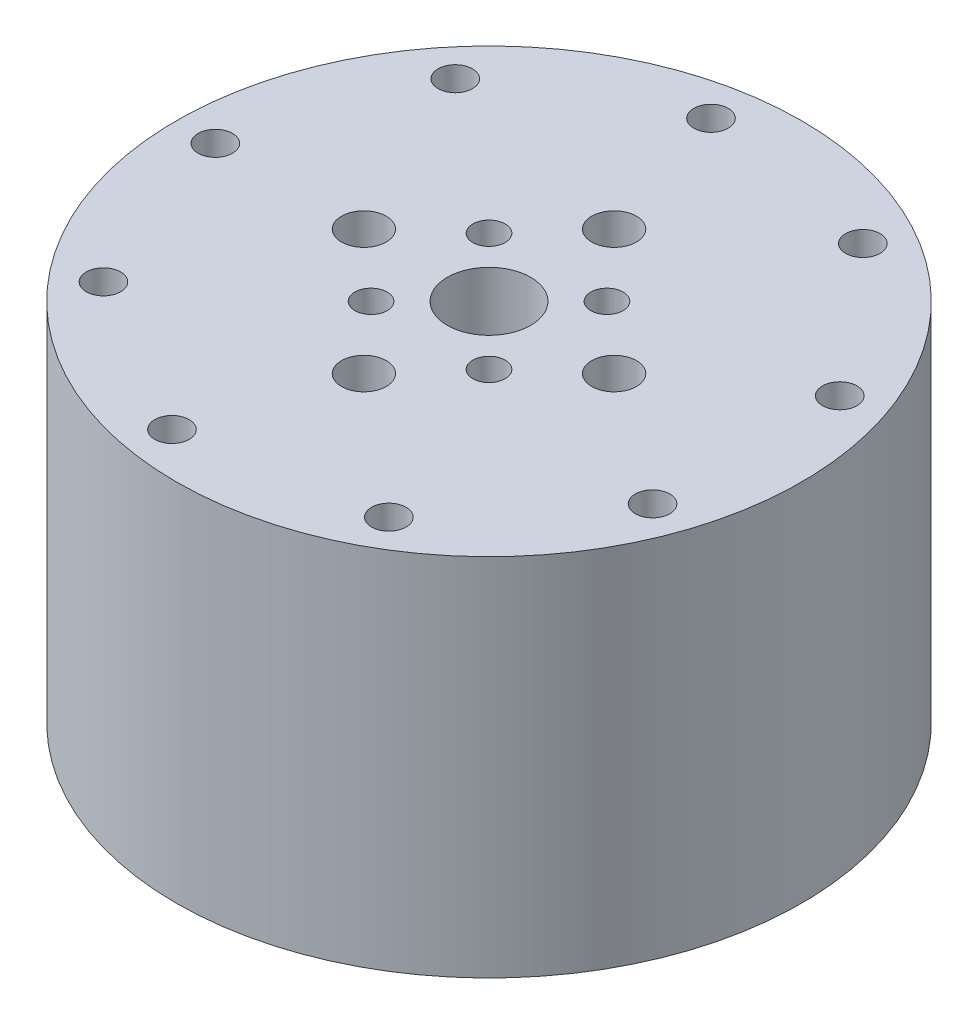
ISO-10303-21;
HEADER;
FILE_DESCRIPTION(('STEP AP214'),'2;1');
FILE_NAME('part.step','',(''),(''),'','','');
FILE_SCHEMA(('AUTOMOTIVE_DESIGN { 1 0 10303 214 1 1 1 1 }'));
ENDSEC;
DATA;
#1=APPLICATION_CONTEXT('core data for automotive mechanical design processes');
#2=APPLICATION_PROTOCOL_DEFINITION('international standard','automotive_design',2000,#1);
#3=PRODUCT_CONTEXT('',#1,'mechanical');
#4=PRODUCT('Part','Part','',(#3));
#5=PRODUCT_RELATED_PRODUCT_CATEGORY('part','',(#4));
#6=PRODUCT_DEFINITION_FORMATION('','',#4);
#7=PRODUCT_DEFINITION_CONTEXT('part definition',#1,'design');
#8=PRODUCT_DEFINITION('design','',#6,#7);
#9=PRODUCT_DEFINITION_SHAPE('','',#8);
#10=(LENGTH_UNIT() NAMED_UNIT(*) SI_UNIT(.MILLI.,.METRE.));
#11=(NAMED_UNIT(*) PLANE_ANGLE_UNIT() SI_UNIT($,.RADIAN.));
#12=(NAMED_UNIT(*) SI_UNIT($,.STERADIAN.) SOLID_ANGLE_UNIT());
#13=UNCERTAINTY_MEASURE_WITH_UNIT(LENGTH_MEASURE(1.E-05),#10,'distance_accuracy_value','');
#14=(GEOMETRIC_REPRESENTATION_CONTEXT(3) GLOBAL_UNCERTAINTY_ASSIGNED_CONTEXT((#13)) GLOBAL_UNIT_ASSIGNED_CONTEXT((#10,
#11,#12)) REPRESENTATION_CONTEXT('',''));
#15=CARTESIAN_POINT('',(0.,0.,0.));
#16=DIRECTION('',(0.,0.,1.));
#17=DIRECTION('',(1.,0.,0.));
#18=AXIS2_PLACEMENT_3D('',#15,#16,#17);
#19=CARTESIAN_POINT('',(0.,35.,0.));
#20=DIRECTION('',(0.,-1.,0.));
#21=DIRECTION('',(0.,0.,-1.));
#22=AXIS2_PLACEMENT_3D('',#19,#20,#21);
#23=CYLINDRICAL_SURFACE('',#22,30.);
#24=CARTESIAN_POINT('',(0.,35.,0.));
#25=DIRECTION('',(0.,1.,0.));
#26=DIRECTION('',(0.,0.,1.));
#27=AXIS2_PLACEMENT_3D('',#24,#25,#26);
#28=CIRCLE('',#27,30.);
#29=CARTESIAN_POINT('',(0.,35.,30.));
#30=VERTEX_POINT('',#29);
#31=EDGE_CURVE('E10',#30,#30,#28,.T.);
#32=ORIENTED_EDGE('',*,*,#31,.F.);
#33=EDGE_LOOP('',(#32));
#34=FACE_BOUND('',#33,.T.);
#35=CARTESIAN_POINT('',(0.,0.,0.));
#36=DIRECTION('',(0.,1.,0.));
#37=DIRECTION('',(0.,0.,1.));
#38=AXIS2_PLACEMENT_3D('',#35,#36,#37);
#39=CIRCLE('',#38,30.);
#40=CARTESIAN_POINT('',(0.,0.,30.));
#41=VERTEX_POINT('',#40);
#42=EDGE_CURVE('E39',#41,#41,#39,.T.);
#43=ORIENTED_EDGE('',*,*,#42,.T.);
#44=EDGE_LOOP('',(#43));
#45=FACE_BOUND('',#44,.T.);
#46=ADVANCED_FACE('F36',(#34,#45),#23,.T.);
#47=CARTESIAN_POINT('',(0.,35.,0.));
#48=DIRECTION('',(0.,1.,0.));
#49=DIRECTION('',(0.,0.,1.));
#50=AXIS2_PLACEMENT_3D('',#47,#48,#49);
#51=PLANE('',#50);
#52=CARTESIAN_POINT('',(0.,35.,12.));
#53=DIRECTION('',(0.,-1.,0.));
#54=DIRECTION('',(0.,0.,-1.));
#55=AXIS2_PLACEMENT_3D('',#52,#53,#54);
#56=CIRCLE('',#55,2.15);
#57=CARTESIAN_POINT('',(0.,35.,9.85));
#58=VERTEX_POINT('',#57);
#59=EDGE_CURVE('E111',#58,#58,#56,.T.);
#60=ORIENTED_EDGE('',*,*,#59,.T.);
#61=EDGE_LOOP('',(#60));
#62=FACE_BOUND('',#61,.T.);
#63=CARTESIAN_POINT('',(5.65685424949233,35.,-5.65685424949243));
#64=DIRECTION('',(0.,-1.,0.));
#65=DIRECTION('',(0.,0.,-1.));
#66=AXIS2_PLACEMENT_3D('',#63,#64,#65);
#67=CIRCLE('',#66,1.55);
#68=CARTESIAN_POINT('',(5.65685424949233,35.,-7.20685424949243));
#69=VERTEX_POINT('',#68);
#70=EDGE_CURVE('E143',#69,#69,#67,.T.);
#71=ORIENTED_EDGE('',*,*,#70,.T.);
#72=EDGE_LOOP('',(#71));
#73=FACE_BOUND('',#72,.T.);
#74=CARTESIAN_POINT('',(5.65685424949241,35.,5.65685424949235));
#75=DIRECTION('',(0.,-1.,0.));
#76=DIRECTION('',(0.,0.,-1.));
#77=AXIS2_PLACEMENT_3D('',#74,#75,#76);
#78=CIRCLE('',#77,1.55);
#79=CARTESIAN_POINT('',(5.65685424949241,35.,4.10685424949235));
#80=VERTEX_POINT('',#79);
#81=EDGE_CURVE('E149',#80,#80,#78,.T.);
#82=ORIENTED_EDGE('',*,*,#81,.T.);
#83=EDGE_LOOP('',(#82));
#84=FACE_BOUND('',#83,.T.);
#85=CARTESIAN_POINT('',(-11.9999999999997,35.,-3.41060513164848E-13));
#86=DIRECTION('',(0.,-1.,0.));
#87=DIRECTION('',(0.,0.,-1.));
#88=AXIS2_PLACEMENT_3D('',#85,#86,#87);
#89=CIRCLE('',#88,2.15000000000055);
#90=CARTESIAN_POINT('',(-11.9999999999997,35.,-2.15000000000089));
#91=VERTEX_POINT('',#90);
#92=EDGE_CURVE('E132',#91,#91,#89,.T.);
#93=ORIENTED_EDGE('',*,*,#92,.T.);
#94=EDGE_LOOP('',(#93));
#95=FACE_BOUND('',#94,.T.);
#96=CARTESIAN_POINT('',(-5.65685424949237,35.,-5.65685424949239));
#97=DIRECTION('',(0.,-1.,0.));
#98=DIRECTION('',(0.,0.,-1.));
#99=AXIS2_PLACEMENT_3D('',#96,#97,#98);
#100=CIRCLE('',#99,1.55);
#101=CARTESIAN_POINT('',(-5.65685424949237,35.,-7.20685424949239));
#102=VERTEX_POINT('',#101);
#103=EDGE_CURVE('E124',#102,#102,#100,.T.);
#104=ORIENTED_EDGE('',*,*,#103,.T.);
#105=EDGE_LOOP('',(#104));
#106=FACE_BOUND('',#105,.T.);
#107=CARTESIAN_POINT('',(12.0000000000003,35.,3.39590937005871E-13));
#108=DIRECTION('',(0.,-1.,0.));
#109=DIRECTION('',(0.,0.,-1.));
#110=AXIS2_PLACEMENT_3D('',#107,#108,#109);
#111=CIRCLE('',#110,2.15000000000027);
#112=CARTESIAN_POINT('',(12.0000000000003,35.,-2.14999999999993));
#113=VERTEX_POINT('',#112);
#114=EDGE_CURVE('E117',#113,#113,#111,.T.);
#115=ORIENTED_EDGE('',*,*,#114,.T.);
#116=EDGE_LOOP('',(#115));
#117=FACE_BOUND('',#116,.T.);
#118=CARTESIAN_POINT('',(-5.65685424949237,35.,5.65685424949239));
#119=DIRECTION('',(0.,-1.,0.));
#120=DIRECTION('',(0.,0.,-1.));
#121=AXIS2_PLACEMENT_3D('',#118,#119,#120);
#122=CIRCLE('',#121,1.55);
#123=CARTESIAN_POINT('',(-5.65685424949237,35.,4.10685424949239));
#124=VERTEX_POINT('',#123);
#125=EDGE_CURVE('E118',#124,#124,#122,.T.);
#126=ORIENTED_EDGE('',*,*,#125,.T.);
#127=EDGE_LOOP('',(#126));
#128=FACE_BOUND('',#127,.T.);
#129=CARTESIAN_POINT('',(6.79181874011743E-13,35.,-12.));
#130=DIRECTION('',(0.,-1.,0.));
#131=DIRECTION('',(0.,0.,-1.));
#132=AXIS2_PLACEMENT_3D('',#129,#130,#131);
#133=CIRCLE('',#132,2.15000000000073);
#134=CARTESIAN_POINT('',(6.79181874011743E-13,35.,-14.1500000000007));
#135=VERTEX_POINT('',#134);
#136=EDGE_CURVE('E131',#135,#135,#133,.T.);
#137=ORIENTED_EDGE('',*,*,#136,.T.);
#138=EDGE_LOOP('',(#137));
#139=FACE_BOUND('',#138,.T.);
#140=CARTESIAN_POINT('',(0.,35.,0.));
#141=DIRECTION('',(0.,-1.,0.));
#142=DIRECTION('',(0.,0.,-1.));
#143=AXIS2_PLACEMENT_3D('',#140,#141,#142);
#144=CIRCLE('',#143,4.);
#145=CARTESIAN_POINT('',(0.,35.,-4.));
#146=VERTEX_POINT('',#145);
#147=EDGE_CURVE('E105',#146,#146,#144,.T.);
#148=ORIENTED_EDGE('',*,*,#147,.T.);
#149=EDGE_LOOP('',(#148));
#150=FACE_BOUND('',#149,.T.);
#151=CARTESIAN_POINT('',(-26.25,35.,0.));
#152=DIRECTION('',(0.,-1.,0.));
#153=DIRECTION('',(0.,0.,-1.));
#154=AXIS2_PLACEMENT_3D('',#151,#152,#153);
#155=CIRCLE('',#154,1.65);
#156=CARTESIAN_POINT('',(-26.25,35.,-1.65));
#157=VERTEX_POINT('',#156);
#158=EDGE_CURVE('E46',#157,#157,#155,.T.);
#159=ORIENTED_EDGE('',*,*,#158,.T.);
#160=EDGE_LOOP('',(#159));
#161=FACE_BOUND('',#160,.T.);
#162=CARTESIAN_POINT('',(-20.1086666318732,35.,16.8731747542717));
#163=DIRECTION('',(0.,-1.,0.));
#164=DIRECTION('',(0.,0.,-1.));
#165=AXIS2_PLACEMENT_3D('',#162,#163,#164);
#166=CIRCLE('',#165,1.65);
#167=CARTESIAN_POINT('',(-20.1086666318732,35.,15.2231747542717));
#168=VERTEX_POINT('',#167);
#169=EDGE_CURVE('E94',#168,#168,#166,.T.);
#170=ORIENTED_EDGE('',*,*,#169,.T.);
#171=EDGE_LOOP('',(#170));
#172=FACE_BOUND('',#171,.T.);
#173=CARTESIAN_POINT('',(-4.55826466375685,35.,25.8512035165705));
#174=DIRECTION('',(0.,-1.,0.));
#175=DIRECTION('',(0.,0.,-1.));
#176=AXIS2_PLACEMENT_3D('',#173,#174,#175);
#177=CIRCLE('',#176,1.65);
#178=CARTESIAN_POINT('',(-4.55826466375685,35.,24.2012035165705));
#179=VERTEX_POINT('',#178);
#180=EDGE_CURVE('E88',#179,#179,#177,.T.);
#181=ORIENTED_EDGE('',*,*,#180,.T.);
#182=EDGE_LOOP('',(#181));
#183=FACE_BOUND('',#182,.T.);
#184=CARTESIAN_POINT('',(13.1250000000001,35.,22.7331668493415));
#185=DIRECTION('',(0.,-1.,0.));
#186=DIRECTION('',(0.,0.,-1.));
#187=AXIS2_PLACEMENT_3D('',#184,#185,#186);
#188=CIRCLE('',#187,1.65);
#189=CARTESIAN_POINT('',(13.1250000000001,35.,21.0831668493415));
#190=VERTEX_POINT('',#189);
#191=EDGE_CURVE('E82',#190,#190,#188,.T.);
#192=ORIENTED_EDGE('',*,*,#191,.T.);
#193=EDGE_LOOP('',(#192));
#194=FACE_BOUND('',#193,.T.);
#195=CARTESIAN_POINT('',(24.6669312956301,35.,8.97802876229866));
#196=DIRECTION('',(0.,-1.,0.));
#197=DIRECTION('',(0.,0.,-1.));
#198=AXIS2_PLACEMENT_3D('',#195,#196,#197);
#199=CIRCLE('',#198,1.65);
#200=CARTESIAN_POINT('',(24.6669312956301,35.,7.32802876229866));
#201=VERTEX_POINT('',#200);
#202=EDGE_CURVE('E76',#201,#201,#199,.T.);
#203=ORIENTED_EDGE('',*,*,#202,.T.);
#204=EDGE_LOOP('',(#203));
#205=FACE_BOUND('',#204,.T.);
#206=CARTESIAN_POINT('',(24.66693129563,35.,-8.97802876229899));
#207=DIRECTION('',(0.,-1.,0.));
#208=DIRECTION('',(0.,0.,-1.));
#209=AXIS2_PLACEMENT_3D('',#206,#207,#208);
#210=CIRCLE('',#209,1.65);
#211=CARTESIAN_POINT('',(24.66693129563,35.,-10.628028762299));
#212=VERTEX_POINT('',#211);
#213=EDGE_CURVE('E70',#212,#212,#210,.T.);
#214=ORIENTED_EDGE('',*,*,#213,.T.);
#215=EDGE_LOOP('',(#214));
#216=FACE_BOUND('',#215,.T.);
#217=CARTESIAN_POINT('',(13.1249999999998,35.,-22.7331668493416));
#218=DIRECTION('',(0.,-1.,0.));
#219=DIRECTION('',(0.,0.,-1.));
#220=AXIS2_PLACEMENT_3D('',#217,#218,#219);
#221=CIRCLE('',#220,1.65);
#222=CARTESIAN_POINT('',(13.1249999999998,35.,-24.3831668493416));
#223=VERTEX_POINT('',#222);
#224=EDGE_CURVE('E64',#223,#223,#221,.T.);
#225=ORIENTED_EDGE('',*,*,#224,.T.);
#226=EDGE_LOOP('',(#225));
#227=FACE_BOUND('',#226,.T.);
#228=CARTESIAN_POINT('',(-4.55826466375719,35.,-25.8512035165704));
#229=DIRECTION('',(0.,-1.,0.));
#230=DIRECTION('',(0.,0.,-1.));
#231=AXIS2_PLACEMENT_3D('',#228,#229,#230);
#232=CIRCLE('',#231,1.65);
#233=CARTESIAN_POINT('',(-4.55826466375719,35.,-27.5012035165704));
#234=VERTEX_POINT('',#233);
#235=EDGE_CURVE('E58',#234,#234,#232,.T.);
#236=ORIENTED_EDGE('',*,*,#235,.T.);
#237=EDGE_LOOP('',(#236));
#238=FACE_BOUND('',#237,.T.);
#239=CARTESIAN_POINT('',(-20.1086666318734,35.,-16.8731747542714));
#240=DIRECTION('',(0.,-1.,0.));
#241=DIRECTION('',(0.,0.,-1.));
#242=AXIS2_PLACEMENT_3D('',#239,#240,#241);
#243=CIRCLE('',#242,1.65);
#244=CARTESIAN_POINT('',(-20.1086666318734,35.,-18.5231747542714));
#245=VERTEX_POINT('',#244);
#246=EDGE_CURVE('E51',#245,#245,#243,.T.);
#247=ORIENTED_EDGE('',*,*,#246,.T.);
#248=EDGE_LOOP('',(#247));
#249=FACE_BOUND('',#248,.T.);
#250=ORIENTED_EDGE('',*,*,#31,.T.);
#251=EDGE_LOOP('',(#250));
#252=FACE_BOUND('',#251,.T.);
#253=ADVANCED_FACE('F162',(#62,#73,#84,#95,#106,#117,#128,#139,#150,#161,#172,#183,#194,#205,
#216,#227,#238,#249,#252),#51,.T.);
#254=CARTESIAN_POINT('',(0.,0.,0.));
#255=DIRECTION('',(0.,1.,0.));
#256=DIRECTION('',(0.,0.,1.));
#257=AXIS2_PLACEMENT_3D('',#254,#255,#256);
#258=PLANE('',#257);
#259=CARTESIAN_POINT('',(0.,0.,0.));
#260=DIRECTION('',(0.,-1.,0.));
#261=DIRECTION('',(0.,0.,-1.));
#262=AXIS2_PLACEMENT_3D('',#259,#260,#261);
#263=CIRCLE('',#262,20.);
#264=CARTESIAN_POINT('',(0.,0.,-20.));
#265=VERTEX_POINT('',#264);
#266=EDGE_CURVE('E102',#265,#265,#263,.T.);
#267=ORIENTED_EDGE('',*,*,#266,.F.);
#268=EDGE_LOOP('',(#267));
#269=FACE_BOUND('',#268,.T.);
#270=CARTESIAN_POINT('',(-26.25,0.,0.));
#271=DIRECTION('',(0.,-1.,0.));
#272=DIRECTION('',(0.,0.,-1.));
#273=AXIS2_PLACEMENT_3D('',#270,#271,#272);
#274=CIRCLE('',#273,1.65);
#275=CARTESIAN_POINT('',(-26.25,0.,-1.65));
#276=VERTEX_POINT('',#275);
#277=EDGE_CURVE('E97',#276,#276,#274,.T.);
#278=ORIENTED_EDGE('',*,*,#277,.F.);
#279=EDGE_LOOP('',(#278));
#280=FACE_BOUND('',#279,.T.);
#281=CARTESIAN_POINT('',(-20.1086666318732,0.,16.8731747542717));
#282=DIRECTION('',(0.,-1.,0.));
#283=DIRECTION('',(0.,0.,-1.));
#284=AXIS2_PLACEMENT_3D('',#281,#282,#283);
#285=CIRCLE('',#284,1.65);
#286=CARTESIAN_POINT('',(-20.1086666318732,0.,15.2231747542717));
#287=VERTEX_POINT('',#286);
#288=EDGE_CURVE('E91',#287,#287,#285,.T.);
#289=ORIENTED_EDGE('',*,*,#288,.F.);
#290=EDGE_LOOP('',(#289));
#291=FACE_BOUND('',#290,.T.);
#292=CARTESIAN_POINT('',(-4.55826466375685,0.,25.8512035165705));
#293=DIRECTION('',(0.,-1.,0.));
#294=DIRECTION('',(0.,0.,-1.));
#295=AXIS2_PLACEMENT_3D('',#292,#293,#294);
#296=CIRCLE('',#295,1.65);
#297=CARTESIAN_POINT('',(-4.55826466375685,0.,24.2012035165705));
#298=VERTEX_POINT('',#297);
#299=EDGE_CURVE('E85',#298,#298,#296,.T.);
#300=ORIENTED_EDGE('',*,*,#299,.F.);
#301=EDGE_LOOP('',(#300));
#302=FACE_BOUND('',#301,.T.);
#303=CARTESIAN_POINT('',(13.1250000000001,0.,22.7331668493415));
#304=DIRECTION('',(0.,-1.,0.));
#305=DIRECTION('',(0.,0.,-1.));
#306=AXIS2_PLACEMENT_3D('',#303,#304,#305);
#307=CIRCLE('',#306,1.65);
#308=CARTESIAN_POINT('',(13.1250000000001,0.,21.0831668493415));
#309=VERTEX_POINT('',#308);
#310=EDGE_CURVE('E79',#309,#309,#307,.T.);
#311=ORIENTED_EDGE('',*,*,#310,.F.);
#312=EDGE_LOOP('',(#311));
#313=FACE_BOUND('',#312,.T.);
#314=CARTESIAN_POINT('',(24.6669312956301,0.,8.97802876229866));
#315=DIRECTION('',(0.,-1.,0.));
#316=DIRECTION('',(0.,0.,-1.));
#317=AXIS2_PLACEMENT_3D('',#314,#315,#316);
#318=CIRCLE('',#317,1.65);
#319=CARTESIAN_POINT('',(24.6669312956301,0.,7.32802876229866));
#320=VERTEX_POINT('',#319);
#321=EDGE_CURVE('E73',#320,#320,#318,.T.);
#322=ORIENTED_EDGE('',*,*,#321,.F.);
#323=EDGE_LOOP('',(#322));
#324=FACE_BOUND('',#323,.T.);
#325=CARTESIAN_POINT('',(24.66693129563,0.,-8.97802876229899));
#326=DIRECTION('',(0.,-1.,0.));
#327=DIRECTION('',(0.,0.,-1.));
#328=AXIS2_PLACEMENT_3D('',#325,#326,#327);
#329=CIRCLE('',#328,1.65);
#330=CARTESIAN_POINT('',(24.66693129563,0.,-10.628028762299));
#331=VERTEX_POINT('',#330);
#332=EDGE_CURVE('E67',#331,#331,#329,.T.);
#333=ORIENTED_EDGE('',*,*,#332,.F.);
#334=EDGE_LOOP('',(#333));
#335=FACE_BOUND('',#334,.T.);
#336=CARTESIAN_POINT('',(13.1249999999998,0.,-22.7331668493416));
#337=DIRECTION('',(0.,-1.,0.));
#338=DIRECTION('',(0.,0.,-1.));
#339=AXIS2_PLACEMENT_3D('',#336,#337,#338);
#340=CIRCLE('',#339,1.65);
#341=CARTESIAN_POINT('',(13.1249999999998,0.,-24.3831668493416));
#342=VERTEX_POINT('',#341);
#343=EDGE_CURVE('E61',#342,#342,#340,.T.);
#344=ORIENTED_EDGE('',*,*,#343,.F.);
#345=EDGE_LOOP('',(#344));
#346=FACE_BOUND('',#345,.T.);
#347=CARTESIAN_POINT('',(-4.55826466375719,0.,-25.8512035165704));
#348=DIRECTION('',(0.,-1.,0.));
#349=DIRECTION('',(0.,0.,-1.));
#350=AXIS2_PLACEMENT_3D('',#347,#348,#349);
#351=CIRCLE('',#350,1.65);
#352=CARTESIAN_POINT('',(-4.55826466375719,0.,-27.5012035165704));
#353=VERTEX_POINT('',#352);
#354=EDGE_CURVE('E55',#353,#353,#351,.T.);
#355=ORIENTED_EDGE('',*,*,#354,.F.);
#356=EDGE_LOOP('',(#355));
#357=FACE_BOUND('',#356,.T.);
#358=CARTESIAN_POINT('',(-20.1086666318734,0.,-16.8731747542714));
#359=DIRECTION('',(0.,-1.,0.));
#360=DIRECTION('',(0.,0.,-1.));
#361=AXIS2_PLACEMENT_3D('',#358,#359,#360);
#362=CIRCLE('',#361,1.65);
#363=CARTESIAN_POINT('',(-20.1086666318734,0.,-18.5231747542714));
#364=VERTEX_POINT('',#363);
#365=EDGE_CURVE('E48',#364,#364,#362,.T.);
#366=ORIENTED_EDGE('',*,*,#365,.F.);
#367=EDGE_LOOP('',(#366));
#368=FACE_BOUND('',#367,.T.);
#369=ORIENTED_EDGE('',*,*,#42,.F.);
#370=EDGE_LOOP('',(#369));
#371=FACE_BOUND('',#370,.T.);
#372=ADVANCED_FACE('F202',(#269,#280,#291,#302,#313,#324,#335,#346,#357,#368,#371),#258,.F.);
#373=CARTESIAN_POINT('',(-20.1086666318734,35.,-16.8731747542714));
#374=DIRECTION('',(0.,-1.,0.));
#375=DIRECTION('',(0.,0.,-1.));
#376=AXIS2_PLACEMENT_3D('',#373,#374,#375);
#377=CYLINDRICAL_SURFACE('',#376,1.65);
#378=ORIENTED_EDGE('',*,*,#246,.F.);
#379=EDGE_LOOP('',(#378));
#380=FACE_BOUND('',#379,.T.);
#381=ORIENTED_EDGE('',*,*,#365,.T.);
#382=EDGE_LOOP('',(#381));
#383=FACE_BOUND('',#382,.T.);
#384=ADVANCED_FACE('F205',(#380,#383),#377,.F.);
#385=CARTESIAN_POINT('',(-4.55826466375719,35.,-25.8512035165704));
#386=DIRECTION('',(0.,-1.,0.));
#387=DIRECTION('',(0.,0.,-1.));
#388=AXIS2_PLACEMENT_3D('',#385,#386,#387);
#389=CYLINDRICAL_SURFACE('',#388,1.65);
#390=ORIENTED_EDGE('',*,*,#235,.F.);
#391=EDGE_LOOP('',(#390));
#392=FACE_BOUND('',#391,.T.);
#393=ORIENTED_EDGE('',*,*,#354,.T.);
#394=EDGE_LOOP('',(#393));
#395=FACE_BOUND('',#394,.T.);
#396=ADVANCED_FACE('F237',(#392,#395),#389,.F.);
#397=CARTESIAN_POINT('',(13.1249999999998,35.,-22.7331668493416));
#398=DIRECTION('',(0.,-1.,0.));
#399=DIRECTION('',(0.,0.,-1.));
#400=AXIS2_PLACEMENT_3D('',#397,#398,#399);
#401=CYLINDRICAL_SURFACE('',#400,1.65);
#402=ORIENTED_EDGE('',*,*,#224,.F.);
#403=EDGE_LOOP('',(#402));
#404=FACE_BOUND('',#403,.T.);
#405=ORIENTED_EDGE('',*,*,#343,.T.);
#406=EDGE_LOOP('',(#405));
#407=FACE_BOUND('',#406,.T.);
#408=ADVANCED_FACE('F241',(#404,#407),#401,.F.);
#409=CARTESIAN_POINT('',(24.66693129563,35.,-8.97802876229899));
#410=DIRECTION('',(0.,-1.,0.));
#411=DIRECTION('',(0.,0.,-1.));
#412=AXIS2_PLACEMENT_3D('',#409,#410,#411);
#413=CYLINDRICAL_SURFACE('',#412,1.65);
#414=ORIENTED_EDGE('',*,*,#213,.F.);
#415=EDGE_LOOP('',(#414));
#416=FACE_BOUND('',#415,.T.);
#417=ORIENTED_EDGE('',*,*,#332,.T.);
#418=EDGE_LOOP('',(#417));
#419=FACE_BOUND('',#418,.T.);
#420=ADVANCED_FACE('F245',(#416,#419),#413,.F.);
#421=CARTESIAN_POINT('',(24.6669312956301,35.,8.97802876229866));
#422=DIRECTION('',(0.,-1.,0.));
#423=DIRECTION('',(0.,0.,-1.));
#424=AXIS2_PLACEMENT_3D('',#421,#422,#423);
#425=CYLINDRICAL_SURFACE('',#424,1.65);
#426=ORIENTED_EDGE('',*,*,#202,.F.);
#427=EDGE_LOOP('',(#426));
#428=FACE_BOUND('',#427,.T.);
#429=ORIENTED_EDGE('',*,*,#321,.T.);
#430=EDGE_LOOP('',(#429));
#431=FACE_BOUND('',#430,.T.);
#432=ADVANCED_FACE('F249',(#428,#431),#425,.F.);
#433=CARTESIAN_POINT('',(13.1250000000001,35.,22.7331668493415));
#434=DIRECTION('',(0.,-1.,0.));
#435=DIRECTION('',(0.,0.,-1.));
#436=AXIS2_PLACEMENT_3D('',#433,#434,#435);
#437=CYLINDRICAL_SURFACE('',#436,1.65);
#438=ORIENTED_EDGE('',*,*,#191,.F.);
#439=EDGE_LOOP('',(#438));
#440=FACE_BOUND('',#439,.T.);
#441=ORIENTED_EDGE('',*,*,#310,.T.);
#442=EDGE_LOOP('',(#441));
#443=FACE_BOUND('',#442,.T.);
#444=ADVANCED_FACE('F253',(#440,#443),#437,.F.);
#445=CARTESIAN_POINT('',(-4.55826466375685,35.,25.8512035165705));
#446=DIRECTION('',(0.,-1.,0.));
#447=DIRECTION('',(0.,0.,-1.));
#448=AXIS2_PLACEMENT_3D('',#445,#446,#447);
#449=CYLINDRICAL_SURFACE('',#448,1.65);
#450=ORIENTED_EDGE('',*,*,#180,.F.);
#451=EDGE_LOOP('',(#450));
#452=FACE_BOUND('',#451,.T.);
#453=ORIENTED_EDGE('',*,*,#299,.T.);
#454=EDGE_LOOP('',(#453));
#455=FACE_BOUND('',#454,.T.);
#456=ADVANCED_FACE('F257',(#452,#455),#449,.F.);
#457=CARTESIAN_POINT('',(-20.1086666318732,35.,16.8731747542717));
#458=DIRECTION('',(0.,-1.,0.));
#459=DIRECTION('',(0.,0.,-1.));
#460=AXIS2_PLACEMENT_3D('',#457,#458,#459);
#461=CYLINDRICAL_SURFACE('',#460,1.65);
#462=ORIENTED_EDGE('',*,*,#169,.F.);
#463=EDGE_LOOP('',(#462));
#464=FACE_BOUND('',#463,.T.);
#465=ORIENTED_EDGE('',*,*,#288,.T.);
#466=EDGE_LOOP('',(#465));
#467=FACE_BOUND('',#466,.T.);
#468=ADVANCED_FACE('F261',(#464,#467),#461,.F.);
#469=CARTESIAN_POINT('',(-26.25,35.,0.));
#470=DIRECTION('',(0.,-1.,0.));
#471=DIRECTION('',(0.,0.,-1.));
#472=AXIS2_PLACEMENT_3D('',#469,#470,#471);
#473=CYLINDRICAL_SURFACE('',#472,1.65);
#474=ORIENTED_EDGE('',*,*,#158,.F.);
#475=EDGE_LOOP('',(#474));
#476=FACE_BOUND('',#475,.T.);
#477=ORIENTED_EDGE('',*,*,#277,.T.);
#478=EDGE_LOOP('',(#477));
#479=FACE_BOUND('',#478,.T.);
#480=ADVANCED_FACE('F198',(#476,#479),#473,.F.);
#481=CARTESIAN_POINT('',(0.,10.,0.));
#482=DIRECTION('',(0.,-1.,0.));
#483=DIRECTION('',(0.,0.,-1.));
#484=AXIS2_PLACEMENT_3D('',#481,#482,#483);
#485=CYLINDRICAL_SURFACE('',#484,20.);
#486=CARTESIAN_POINT('',(0.,10.,0.));
#487=DIRECTION('',(0.,-1.,0.));
#488=DIRECTION('',(0.,0.,-1.));
#489=AXIS2_PLACEMENT_3D('',#486,#487,#488);
#490=CIRCLE('',#489,20.);
#491=CARTESIAN_POINT('',(0.,10.,-20.));
#492=VERTEX_POINT('',#491);
#493=EDGE_CURVE('E52',#492,#492,#490,.T.);
#494=ORIENTED_EDGE('',*,*,#493,.F.);
#495=EDGE_LOOP('',(#494));
#496=FACE_BOUND('',#495,.T.);
#497=ORIENTED_EDGE('',*,*,#266,.T.);
#498=EDGE_LOOP('',(#497));
#499=FACE_BOUND('',#498,.T.);
#500=ADVANCED_FACE('F176',(#496,#499),#485,.F.);
#501=CARTESIAN_POINT('',(0.,10.,0.));
#502=DIRECTION('',(0.,-1.,0.));
#503=DIRECTION('',(0.,0.,-1.));
#504=AXIS2_PLACEMENT_3D('',#501,#502,#503);
#505=PLANE('',#504);
#506=CARTESIAN_POINT('',(0.,10.,12.));
#507=DIRECTION('',(0.,-1.,0.));
#508=DIRECTION('',(0.,0.,-1.));
#509=AXIS2_PLACEMENT_3D('',#506,#507,#508);
#510=CIRCLE('',#509,2.15);
#511=CARTESIAN_POINT('',(0.,10.,9.85));
#512=VERTEX_POINT('',#511);
#513=EDGE_CURVE('E127',#512,#512,#510,.T.);
#514=ORIENTED_EDGE('',*,*,#513,.F.);
#515=EDGE_LOOP('',(#514));
#516=FACE_BOUND('',#515,.T.);
#517=CARTESIAN_POINT('',(5.65685424949233,10.,-5.65685424949243));
#518=DIRECTION('',(0.,-1.,0.));
#519=DIRECTION('',(0.,0.,-1.));
#520=AXIS2_PLACEMENT_3D('',#517,#518,#519);
#521=CIRCLE('',#520,1.55);
#522=CARTESIAN_POINT('',(5.65685424949233,10.,-7.20685424949243));
#523=VERTEX_POINT('',#522);
#524=EDGE_CURVE('E140',#523,#523,#521,.T.);
#525=ORIENTED_EDGE('',*,*,#524,.F.);
#526=EDGE_LOOP('',(#525));
#527=FACE_BOUND('',#526,.T.);
#528=CARTESIAN_POINT('',(5.65685424949241,10.,5.65685424949235));
#529=DIRECTION('',(0.,-1.,0.));
#530=DIRECTION('',(0.,0.,-1.));
#531=AXIS2_PLACEMENT_3D('',#528,#529,#530);
#532=CIRCLE('',#531,1.55);
#533=CARTESIAN_POINT('',(5.65685424949241,10.,4.10685424949235));
#534=VERTEX_POINT('',#533);
#535=EDGE_CURVE('E146',#534,#534,#532,.T.);
#536=ORIENTED_EDGE('',*,*,#535,.F.);
#537=EDGE_LOOP('',(#536));
#538=FACE_BOUND('',#537,.T.);
#539=CARTESIAN_POINT('',(-11.9999999999997,10.,-3.41060513164848E-13));
#540=DIRECTION('',(0.,-1.,0.));
#541=DIRECTION('',(0.,0.,-1.));
#542=AXIS2_PLACEMENT_3D('',#539,#540,#541);
#543=CIRCLE('',#542,2.15000000000055);
#544=CARTESIAN_POINT('',(-11.9999999999997,10.,-2.15000000000089));
#545=VERTEX_POINT('',#544);
#546=EDGE_CURVE('E152',#545,#545,#543,.T.);
#547=ORIENTED_EDGE('',*,*,#546,.F.);
#548=EDGE_LOOP('',(#547));
#549=FACE_BOUND('',#548,.T.);
#550=CARTESIAN_POINT('',(-5.65685424949237,10.,-5.65685424949239));
#551=DIRECTION('',(0.,-1.,0.));
#552=DIRECTION('',(0.,0.,-1.));
#553=AXIS2_PLACEMENT_3D('',#550,#551,#552);
#554=CIRCLE('',#553,1.55);
#555=CARTESIAN_POINT('',(-5.65685424949237,10.,-7.20685424949239));
#556=VERTEX_POINT('',#555);
#557=EDGE_CURVE('E121',#556,#556,#554,.T.);
#558=ORIENTED_EDGE('',*,*,#557,.F.);
#559=EDGE_LOOP('',(#558));
#560=FACE_BOUND('',#559,.T.);
#561=CARTESIAN_POINT('',(12.0000000000003,10.,3.39590937005871E-13));
#562=DIRECTION('',(0.,-1.,0.));
#563=DIRECTION('',(0.,0.,-1.));
#564=AXIS2_PLACEMENT_3D('',#561,#562,#563);
#565=CIRCLE('',#564,2.15000000000027);
#566=CARTESIAN_POINT('',(12.0000000000003,10.,-2.14999999999993));
#567=VERTEX_POINT('',#566);
#568=EDGE_CURVE('E114',#567,#567,#565,.T.);
#569=ORIENTED_EDGE('',*,*,#568,.F.);
#570=EDGE_LOOP('',(#569));
#571=FACE_BOUND('',#570,.T.);
#572=CARTESIAN_POINT('',(-5.65685424949237,10.,5.65685424949239));
#573=DIRECTION('',(0.,-1.,0.));
#574=DIRECTION('',(0.,0.,-1.));
#575=AXIS2_PLACEMENT_3D('',#572,#573,#574);
#576=CIRCLE('',#575,1.55);
#577=CARTESIAN_POINT('',(-5.65685424949237,10.,4.10685424949239));
#578=VERTEX_POINT('',#577);
#579=EDGE_CURVE('E135',#578,#578,#576,.T.);
#580=ORIENTED_EDGE('',*,*,#579,.F.);
#581=EDGE_LOOP('',(#580));
#582=FACE_BOUND('',#581,.T.);
#583=CARTESIAN_POINT('',(6.79181874011743E-13,10.,-12.));
#584=DIRECTION('',(0.,-1.,0.));
#585=DIRECTION('',(0.,0.,-1.));
#586=AXIS2_PLACEMENT_3D('',#583,#584,#585);
#587=CIRCLE('',#586,2.15000000000073);
#588=CARTESIAN_POINT('',(6.79181874011743E-13,10.,-14.1500000000007));
#589=VERTEX_POINT('',#588);
#590=EDGE_CURVE('E128',#589,#589,#587,.T.);
#591=ORIENTED_EDGE('',*,*,#590,.F.);
#592=EDGE_LOOP('',(#591));
#593=FACE_BOUND('',#592,.T.);
#594=CARTESIAN_POINT('',(0.,10.,0.));
#595=DIRECTION('',(0.,-1.,0.));
#596=DIRECTION('',(0.,0.,-1.));
#597=AXIS2_PLACEMENT_3D('',#594,#595,#596);
#598=CIRCLE('',#597,4.);
#599=CARTESIAN_POINT('',(0.,10.,-4.));
#600=VERTEX_POINT('',#599);
#601=EDGE_CURVE('E108',#600,#600,#598,.T.);
#602=ORIENTED_EDGE('',*,*,#601,.F.);
#603=EDGE_LOOP('',(#602));
#604=FACE_BOUND('',#603,.T.);
#605=ORIENTED_EDGE('',*,*,#493,.T.);
#606=EDGE_LOOP('',(#605));
#607=FACE_BOUND('',#606,.T.);
#608=ADVANCED_FACE('F172',(#516,#527,#538,#549,#560,#571,#582,#593,#604,#607),#505,.T.);
#609=CARTESIAN_POINT('',(0.,35.,0.));
#610=DIRECTION('',(0.,-1.,0.));
#611=DIRECTION('',(0.,0.,-1.));
#612=AXIS2_PLACEMENT_3D('',#609,#610,#611);
#613=CYLINDRICAL_SURFACE('',#612,4.);
#614=ORIENTED_EDGE('',*,*,#147,.F.);
#615=EDGE_LOOP('',(#614));
#616=FACE_BOUND('',#615,.T.);
#617=ORIENTED_EDGE('',*,*,#601,.T.);
#618=EDGE_LOOP('',(#617));
#619=FACE_BOUND('',#618,.T.);
#620=ADVANCED_FACE('F175',(#616,#619),#613,.F.);
#621=CARTESIAN_POINT('',(6.79181874011743E-13,35.,-12.));
#622=DIRECTION('',(0.,-1.,0.));
#623=DIRECTION('',(0.,0.,-1.));
#624=AXIS2_PLACEMENT_3D('',#621,#622,#623);
#625=CYLINDRICAL_SURFACE('',#624,2.15000000000073);
#626=ORIENTED_EDGE('',*,*,#136,.F.);
#627=EDGE_LOOP('',(#626));
#628=FACE_BOUND('',#627,.T.);
#629=ORIENTED_EDGE('',*,*,#590,.T.);
#630=EDGE_LOOP('',(#629));
#631=FACE_BOUND('',#630,.T.);
#632=ADVANCED_FACE('F271',(#628,#631),#625,.F.);
#633=CARTESIAN_POINT('',(-5.65685424949237,35.,5.65685424949239));
#634=DIRECTION('',(0.,-1.,0.));
#635=DIRECTION('',(0.,0.,-1.));
#636=AXIS2_PLACEMENT_3D('',#633,#634,#635);
#637=CYLINDRICAL_SURFACE('',#636,1.55);
#638=ORIENTED_EDGE('',*,*,#125,.F.);
#639=EDGE_LOOP('',(#638));
#640=FACE_BOUND('',#639,.T.);
#641=ORIENTED_EDGE('',*,*,#579,.T.);
#642=EDGE_LOOP('',(#641));
#643=FACE_BOUND('',#642,.T.);
#644=ADVANCED_FACE('F277',(#640,#643),#637,.F.);
#645=CARTESIAN_POINT('',(12.0000000000003,35.,3.39590937005871E-13));
#646=DIRECTION('',(0.,-1.,0.));
#647=DIRECTION('',(0.,0.,-1.));
#648=AXIS2_PLACEMENT_3D('',#645,#646,#647);
#649=CYLINDRICAL_SURFACE('',#648,2.15000000000027);
#650=ORIENTED_EDGE('',*,*,#114,.F.);
#651=EDGE_LOOP('',(#650));
#652=FACE_BOUND('',#651,.T.);
#653=ORIENTED_EDGE('',*,*,#568,.T.);
#654=EDGE_LOOP('',(#653));
#655=FACE_BOUND('',#654,.T.);
#656=ADVANCED_FACE('F273',(#652,#655),#649,.F.);
#657=CARTESIAN_POINT('',(-5.65685424949237,35.,-5.65685424949239));
#658=DIRECTION('',(0.,-1.,0.));
#659=DIRECTION('',(0.,0.,-1.));
#660=AXIS2_PLACEMENT_3D('',#657,#658,#659);
#661=CYLINDRICAL_SURFACE('',#660,1.55);
#662=ORIENTED_EDGE('',*,*,#103,.F.);
#663=EDGE_LOOP('',(#662));
#664=FACE_BOUND('',#663,.T.);
#665=ORIENTED_EDGE('',*,*,#557,.T.);
#666=EDGE_LOOP('',(#665));
#667=FACE_BOUND('',#666,.T.);
#668=ADVANCED_FACE('F276',(#664,#667),#661,.F.);
#669=CARTESIAN_POINT('',(-11.9999999999997,35.,-3.41060513164848E-13));
#670=DIRECTION('',(0.,-1.,0.));
#671=DIRECTION('',(0.,0.,-1.));
#672=AXIS2_PLACEMENT_3D('',#669,#670,#671);
#673=CYLINDRICAL_SURFACE('',#672,2.15000000000055);
#674=ORIENTED_EDGE('',*,*,#92,.F.);
#675=EDGE_LOOP('',(#674));
#676=FACE_BOUND('',#675,.T.);
#677=ORIENTED_EDGE('',*,*,#546,.T.);
#678=EDGE_LOOP('',(#677));
#679=FACE_BOUND('',#678,.T.);
#680=ADVANCED_FACE('F281',(#676,#679),#673,.F.);
#681=CARTESIAN_POINT('',(5.65685424949241,35.,5.65685424949235));
#682=DIRECTION('',(0.,-1.,0.));
#683=DIRECTION('',(0.,0.,-1.));
#684=AXIS2_PLACEMENT_3D('',#681,#682,#683);
#685=CYLINDRICAL_SURFACE('',#684,1.55);
#686=ORIENTED_EDGE('',*,*,#81,.F.);
#687=EDGE_LOOP('',(#686));
#688=FACE_BOUND('',#687,.T.);
#689=ORIENTED_EDGE('',*,*,#535,.T.);
#690=EDGE_LOOP('',(#689));
#691=FACE_BOUND('',#690,.T.);
#692=ADVANCED_FACE('F291',(#688,#691),#685,.F.);
#693=CARTESIAN_POINT('',(5.65685424949233,35.,-5.65685424949243));
#694=DIRECTION('',(0.,-1.,0.));
#695=DIRECTION('',(0.,0.,-1.));
#696=AXIS2_PLACEMENT_3D('',#693,#694,#695);
#697=CYLINDRICAL_SURFACE('',#696,1.55);
#698=ORIENTED_EDGE('',*,*,#70,.F.);
#699=EDGE_LOOP('',(#698));
#700=FACE_BOUND('',#699,.T.);
#701=ORIENTED_EDGE('',*,*,#524,.T.);
#702=EDGE_LOOP('',(#701));
#703=FACE_BOUND('',#702,.T.);
#704=ADVANCED_FACE('F168',(#700,#703),#697,.F.);
#705=CARTESIAN_POINT('',(0.,35.,12.));
#706=DIRECTION('',(0.,-1.,0.));
#707=DIRECTION('',(0.,0.,-1.));
#708=AXIS2_PLACEMENT_3D('',#705,#706,#707);
#709=CYLINDRICAL_SURFACE('',#708,2.15);
#710=ORIENTED_EDGE('',*,*,#59,.F.);
#711=EDGE_LOOP('',(#710));
#712=FACE_BOUND('',#711,.T.);
#713=ORIENTED_EDGE('',*,*,#513,.T.);
#714=EDGE_LOOP('',(#713));
#715=FACE_BOUND('',#714,.T.);
#716=ADVANCED_FACE('F165',(#712,#715),#709,.F.);
#717=CLOSED_SHELL('',(#46,#253,#372,#384,#396,#408,#420,#432,#444,#456,#468,#480,#500,#608,#620,
#632,#644,#656,#668,#680,#692,#704,#716));
#718=MANIFOLD_SOLID_BREP('B2',#717);
#719=ADVANCED_BREP_SHAPE_REPRESENTATION('',(#18,#718),#14);
#720=SHAPE_DEFINITION_REPRESENTATION(#9,#719);
ENDSEC;
END-ISO-10303-21;
